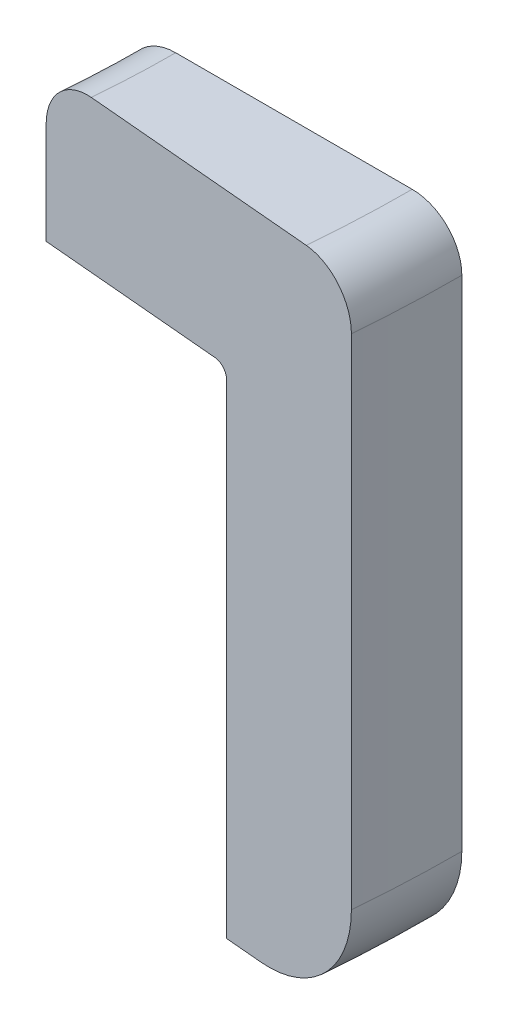
ISO-10303-21;
HEADER;
FILE_DESCRIPTION(('STEP AP214'),'2;1');
FILE_NAME('part.step','',(''),(''),'','','');
FILE_SCHEMA(('AUTOMOTIVE_DESIGN { 1 0 10303 214 1 1 1 1 }'));
ENDSEC;
DATA;
#1=APPLICATION_CONTEXT('core data for automotive mechanical design processes');
#2=APPLICATION_PROTOCOL_DEFINITION('international standard','automotive_design',2000,#1);
#3=PRODUCT_CONTEXT('',#1,'mechanical');
#4=PRODUCT('Part','Part','',(#3));
#5=PRODUCT_RELATED_PRODUCT_CATEGORY('part','',(#4));
#6=PRODUCT_DEFINITION_FORMATION('','',#4);
#7=PRODUCT_DEFINITION_CONTEXT('part definition',#1,'design');
#8=PRODUCT_DEFINITION('design','',#6,#7);
#9=PRODUCT_DEFINITION_SHAPE('','',#8);
#10=(LENGTH_UNIT() NAMED_UNIT(*) SI_UNIT(.MILLI.,.METRE.));
#11=(NAMED_UNIT(*) PLANE_ANGLE_UNIT() SI_UNIT($,.RADIAN.));
#12=(NAMED_UNIT(*) SI_UNIT($,.STERADIAN.) SOLID_ANGLE_UNIT());
#13=UNCERTAINTY_MEASURE_WITH_UNIT(LENGTH_MEASURE(1.E-05),#10,'distance_accuracy_value','');
#14=(GEOMETRIC_REPRESENTATION_CONTEXT(3) GLOBAL_UNCERTAINTY_ASSIGNED_CONTEXT((#13)) GLOBAL_UNIT_ASSIGNED_CONTEXT((#10,
#11,#12)) REPRESENTATION_CONTEXT('',''));
#15=CARTESIAN_POINT('',(0.,0.,0.));
#16=DIRECTION('',(0.,0.,1.));
#17=DIRECTION('',(1.,0.,0.));
#18=AXIS2_PLACEMENT_3D('',#15,#16,#17);
#19=CARTESIAN_POINT('',(-0.165150102818243,-6.,3.78255923524837));
#20=DIRECTION('',(0.,1.,0.));
#21=DIRECTION('',(-1.,0.,0.));
#22=AXIS2_PLACEMENT_3D('',#19,#20,#21);
#23=PLANE('',#22);
#24=CARTESIAN_POINT('',(-43.4,-6.00000000000001,0.));
#25=DIRECTION('',(0.,1.,0.));
#26=DIRECTION('',(-1.,0.,0.));
#27=AXIS2_PLACEMENT_3D('',#24,#25,#26);
#28=CIRCLE('',#27,44.9330690308202);
#29=CARTESIAN_POINT('',(1.3620851374935,-6.,3.91617500531294));
#30=VERTEX_POINT('',#29);
#31=CARTESIAN_POINT('',(1.5330690308202,-6.,0.));
#32=VERTEX_POINT('',#31);
#33=EDGE_CURVE('E42',#30,#32,#28,.T.);
#34=ORIENTED_EDGE('',*,*,#33,.F.);
#35=DIRECTION('',(0.996194698091746,0.,0.0871557427476584));
#36=VECTOR('',#35,1.);
#37=CARTESIAN_POINT('',(-0.165150102818243,-6.,3.78255923524837));
#38=LINE('',#37,#36);
#39=CARTESIAN_POINT('',(-0.165150102818243,-6.,3.78255923524837));
#40=VERTEX_POINT('',#39);
#41=EDGE_CURVE('E125',#40,#30,#38,.T.);
#42=ORIENTED_EDGE('',*,*,#41,.F.);
#43=CARTESIAN_POINT('',(-43.4,-6.00000000000001,0.));
#44=DIRECTION('',(0.,1.,0.));
#45=DIRECTION('',(-1.,0.,0.));
#46=AXIS2_PLACEMENT_3D('',#43,#44,#45);
#47=CIRCLE('',#46,43.4);
#48=CARTESIAN_POINT('',(0.,-6.,0.));
#49=VERTEX_POINT('',#48);
#50=EDGE_CURVE('E11',#40,#49,#47,.T.);
#51=ORIENTED_EDGE('',*,*,#50,.T.);
#52=DIRECTION('',(1.,0.,0.));
#53=VECTOR('',#52,1.);
#54=CARTESIAN_POINT('',(0.,-6.,0.));
#55=LINE('',#54,#53);
#56=EDGE_CURVE('E122',#49,#32,#55,.T.);
#57=ORIENTED_EDGE('',*,*,#56,.T.);
#58=EDGE_LOOP('',(#34,#42,#51,#57));
#59=FACE_BOUND('',#58,.T.);
#60=ADVANCED_FACE('F35',(#59),#23,.F.);
#61=CARTESIAN_POINT('',(-43.4,-2.00000000000001,0.));
#62=DIRECTION('',(0.,1.,0.));
#63=DIRECTION('',(-1.,0.,0.));
#64=AXIS2_PLACEMENT_3D('',#61,#62,#63);
#65=TOROIDAL_SURFACE('',#64,44.9330690308202,4.);
#66=CARTESIAN_POINT('',(-43.4,-1.99999999999998,0.));
#67=DIRECTION('',(0.,1.,0.));
#68=DIRECTION('',(-1.,0.,0.));
#69=AXIS2_PLACEMENT_3D('',#66,#67,#68);
#70=CIRCLE('',#69,48.9330690308202);
#71=CARTESIAN_POINT('',(5.3468639298605,-1.99999999999997,4.26479797630358));
#72=VERTEX_POINT('',#71);
#73=CARTESIAN_POINT('',(5.53306903082023,-1.99999999999997,0.));
#74=VERTEX_POINT('',#73);
#75=EDGE_CURVE('E187',#72,#74,#70,.T.);
#76=ORIENTED_EDGE('',*,*,#75,.F.);
#77=CARTESIAN_POINT('',(1.36208513749352,-2.,3.91617500531294));
#78=DIRECTION('',(-0.0871557427476584,0.,0.996194698091746));
#79=DIRECTION('',(0.996194698091746,0.,0.0871557427476584));
#80=AXIS2_PLACEMENT_3D('',#77,#78,#79);
#81=CIRCLE('',#80,4.);
#82=EDGE_CURVE('E152',#30,#72,#81,.T.);
#83=ORIENTED_EDGE('',*,*,#82,.F.);
#84=ORIENTED_EDGE('',*,*,#33,.T.);
#85=CARTESIAN_POINT('',(1.53306903082023,-2.,0.));
#86=DIRECTION('',(0.,0.,1.));
#87=DIRECTION('',(1.,0.,0.));
#88=AXIS2_PLACEMENT_3D('',#85,#86,#87);
#89=CIRCLE('',#88,4.);
#90=EDGE_CURVE('E129',#32,#74,#89,.T.);
#91=ORIENTED_EDGE('',*,*,#90,.T.);
#92=EDGE_LOOP('',(#76,#83,#84,#91));
#93=FACE_BOUND('',#92,.T.);
#94=ADVANCED_FACE('F190',(#93),#65,.T.);
#95=CARTESIAN_POINT('',(-43.4,20.1095839330054,0.));
#96=DIRECTION('',(0.,1.,0.));
#97=DIRECTION('',(-1.,0.,0.));
#98=AXIS2_PLACEMENT_3D('',#95,#96,#97);
#99=CYLINDRICAL_SURFACE('',#98,48.9330690308202);
#100=CARTESIAN_POINT('',(-43.4,18.1095839330053,0.));
#101=DIRECTION('',(0.,1.,0.));
#102=DIRECTION('',(-1.,0.,0.));
#103=AXIS2_PLACEMENT_3D('',#100,#101,#102);
#104=CIRCLE('',#103,48.9330690308202);
#105=CARTESIAN_POINT('',(5.3468639298605,18.1095839330053,4.26479797630358));
#106=VERTEX_POINT('',#105);
#107=CARTESIAN_POINT('',(5.53306903082023,18.1095839330053,0.));
#108=VERTEX_POINT('',#107);
#109=EDGE_CURVE('E184',#106,#108,#104,.T.);
#110=ORIENTED_EDGE('',*,*,#109,.F.);
#111=DIRECTION('',(0.,1.,0.));
#112=VECTOR('',#111,1.);
#113=CARTESIAN_POINT('',(5.3468639298605,0.,4.26479797630358));
#114=LINE('',#113,#112);
#115=EDGE_CURVE('E155',#72,#106,#114,.T.);
#116=ORIENTED_EDGE('',*,*,#115,.F.);
#117=ORIENTED_EDGE('',*,*,#75,.T.);
#118=DIRECTION('',(0.,1.,0.));
#119=VECTOR('',#118,1.);
#120=CARTESIAN_POINT('',(5.53306903082023,0.,0.));
#121=LINE('',#120,#119);
#122=EDGE_CURVE('E131',#74,#108,#121,.T.);
#123=ORIENTED_EDGE('',*,*,#122,.T.);
#124=EDGE_LOOP('',(#110,#116,#117,#123));
#125=FACE_BOUND('',#124,.T.);
#126=ADVANCED_FACE('F217',(#125),#99,.T.);
#127=CARTESIAN_POINT('',(-43.4,18.1095839330054,0.));
#128=DIRECTION('',(0.,1.,0.));
#129=DIRECTION('',(-1.,0.,0.));
#130=AXIS2_PLACEMENT_3D('',#127,#128,#129);
#131=TOROIDAL_SURFACE('',#130,46.9330690308202,2.);
#132=CARTESIAN_POINT('',(-43.4,20.1095839330053,0.));
#133=DIRECTION('',(0.,1.,0.));
#134=DIRECTION('',(-1.,0.,0.));
#135=AXIS2_PLACEMENT_3D('',#132,#133,#134);
#136=CIRCLE('',#135,46.9330690308202);
#137=CARTESIAN_POINT('',(3.354474533677,20.1095839330054,4.09048649080826));
#138=VERTEX_POINT('',#137);
#139=CARTESIAN_POINT('',(3.53306903082022,20.1095839330054,0.));
#140=VERTEX_POINT('',#139);
#141=EDGE_CURVE('E182',#138,#140,#136,.T.);
#142=ORIENTED_EDGE('',*,*,#141,.F.);
#143=CARTESIAN_POINT('',(3.35447453367701,18.1095839330054,4.09048649080826));
#144=DIRECTION('',(-0.0871557427476584,0.,0.996194698091746));
#145=DIRECTION('',(0.996194698091746,0.,0.0871557427476584));
#146=AXIS2_PLACEMENT_3D('',#143,#144,#145);
#147=CIRCLE('',#146,2.);
#148=EDGE_CURVE('E157',#106,#138,#147,.T.);
#149=ORIENTED_EDGE('',*,*,#148,.F.);
#150=ORIENTED_EDGE('',*,*,#109,.T.);
#151=CARTESIAN_POINT('',(3.53306903082023,18.1095839330054,0.));
#152=DIRECTION('',(0.,0.,1.));
#153=DIRECTION('',(1.,0.,0.));
#154=AXIS2_PLACEMENT_3D('',#151,#152,#153);
#155=CIRCLE('',#154,2.);
#156=EDGE_CURVE('E135',#108,#140,#155,.T.);
#157=ORIENTED_EDGE('',*,*,#156,.T.);
#158=EDGE_LOOP('',(#142,#149,#150,#157));
#159=FACE_BOUND('',#158,.T.);
#160=ADVANCED_FACE('F214',(#159),#131,.T.);
#161=CARTESIAN_POINT('',(3.354474533677,20.1095839330054,4.09048649080826));
#162=DIRECTION('',(0.,-1.,0.));
#163=DIRECTION('',(1.,0.,0.));
#164=AXIS2_PLACEMENT_3D('',#161,#162,#163);
#165=PLANE('',#164);
#166=CARTESIAN_POINT('',(-43.4,20.1095839330054,0.));
#167=DIRECTION('',(0.,1.,0.));
#168=DIRECTION('',(-1.,0.,0.));
#169=AXIS2_PLACEMENT_3D('',#166,#167,#168);
#170=CIRCLE('',#169,37.4);
#171=CARTESIAN_POINT('',(-6.1423182913687,20.1095839330054,3.25962477876242));
#172=VERTEX_POINT('',#171);
#173=CARTESIAN_POINT('',(-5.99999999999999,20.1095839330054,0.));
#174=VERTEX_POINT('',#173);
#175=EDGE_CURVE('E180',#172,#174,#170,.T.);
#176=ORIENTED_EDGE('',*,*,#175,.F.);
#177=DIRECTION('',(-0.996194698091746,0.,-0.0871557427476584));
#178=VECTOR('',#177,1.);
#179=CARTESIAN_POINT('',(3.354474533677,20.1095839330054,4.09048649080826));
#180=LINE('',#179,#178);
#181=EDGE_CURVE('E160',#138,#172,#180,.T.);
#182=ORIENTED_EDGE('',*,*,#181,.F.);
#183=ORIENTED_EDGE('',*,*,#141,.T.);
#184=DIRECTION('',(-1.,0.,0.));
#185=VECTOR('',#184,1.);
#186=CARTESIAN_POINT('',(3.53306903082022,20.1095839330054,0.));
#187=LINE('',#186,#185);
#188=EDGE_CURVE('E138',#140,#174,#187,.T.);
#189=ORIENTED_EDGE('',*,*,#188,.T.);
#190=EDGE_LOOP('',(#176,#182,#183,#189));
#191=FACE_BOUND('',#190,.T.);
#192=ADVANCED_FACE('F210',(#191),#165,.F.);
#193=CARTESIAN_POINT('',(-43.4,18.1095839330054,0.));
#194=DIRECTION('',(0.,1.,0.));
#195=DIRECTION('',(-1.,0.,0.));
#196=AXIS2_PLACEMENT_3D('',#193,#194,#195);
#197=TOROIDAL_SURFACE('',#196,37.4,2.);
#198=CARTESIAN_POINT('',(-43.4,18.1095839330053,0.));
#199=DIRECTION('',(0.,1.,0.));
#200=DIRECTION('',(-1.,0.,0.));
#201=AXIS2_PLACEMENT_3D('',#198,#199,#200);
#202=CIRCLE('',#201,35.4);
#203=CARTESIAN_POINT('',(-8.13470768755221,18.1095839330053,3.08531329326711));
#204=VERTEX_POINT('',#203);
#205=CARTESIAN_POINT('',(-8.,18.1095839330053,0.));
#206=VERTEX_POINT('',#205);
#207=EDGE_CURVE('E178',#204,#206,#202,.T.);
#208=ORIENTED_EDGE('',*,*,#207,.F.);
#209=CARTESIAN_POINT('',(-6.14231829136872,18.1095839330054,3.25962477876242));
#210=DIRECTION('',(-0.0871557427476584,0.,0.996194698091746));
#211=DIRECTION('',(0.996194698091746,0.,0.0871557427476584));
#212=AXIS2_PLACEMENT_3D('',#209,#210,#211);
#213=CIRCLE('',#212,2.);
#214=EDGE_CURVE('E163',#172,#204,#213,.T.);
#215=ORIENTED_EDGE('',*,*,#214,.F.);
#216=ORIENTED_EDGE('',*,*,#175,.T.);
#217=CARTESIAN_POINT('',(-6.,18.1095839330054,0.));
#218=DIRECTION('',(0.,0.,1.));
#219=DIRECTION('',(1.,0.,0.));
#220=AXIS2_PLACEMENT_3D('',#217,#218,#219);
#221=CIRCLE('',#220,2.);
#222=EDGE_CURVE('E141',#174,#206,#221,.T.);
#223=ORIENTED_EDGE('',*,*,#222,.T.);
#224=EDGE_LOOP('',(#208,#215,#216,#223));
#225=FACE_BOUND('',#224,.T.);
#226=ADVANCED_FACE('F206',(#225),#197,.T.);
#227=CARTESIAN_POINT('',(-43.4,20.1095839330054,0.));
#228=DIRECTION('',(0.,1.,0.));
#229=DIRECTION('',(-1.,0.,0.));
#230=AXIS2_PLACEMENT_3D('',#227,#228,#229);
#231=CYLINDRICAL_SURFACE('',#230,35.4);
#232=CARTESIAN_POINT('',(-43.4,14.,0.));
#233=DIRECTION('',(0.,1.,0.));
#234=DIRECTION('',(-1.,0.,0.));
#235=AXIS2_PLACEMENT_3D('',#232,#233,#234);
#236=CIRCLE('',#235,35.4);
#237=CARTESIAN_POINT('',(-8.13470768755221,14.,3.08531329326711));
#238=VERTEX_POINT('',#237);
#239=CARTESIAN_POINT('',(-8.,14.,0.));
#240=VERTEX_POINT('',#239);
#241=EDGE_CURVE('E176',#238,#240,#236,.T.);
#242=ORIENTED_EDGE('',*,*,#241,.F.);
#243=DIRECTION('',(0.,-1.,0.));
#244=VECTOR('',#243,1.);
#245=CARTESIAN_POINT('',(-8.13470768755221,14.,3.08531329326711));
#246=LINE('',#245,#244);
#247=EDGE_CURVE('E166',#204,#238,#246,.T.);
#248=ORIENTED_EDGE('',*,*,#247,.F.);
#249=ORIENTED_EDGE('',*,*,#207,.T.);
#250=DIRECTION('',(0.,-1.,0.));
#251=VECTOR('',#250,1.);
#252=CARTESIAN_POINT('',(-8.,14.,0.));
#253=LINE('',#252,#251);
#254=EDGE_CURVE('E144',#206,#240,#253,.T.);
#255=ORIENTED_EDGE('',*,*,#254,.T.);
#256=EDGE_LOOP('',(#242,#248,#249,#255));
#257=FACE_BOUND('',#256,.T.);
#258=ADVANCED_FACE('F203',(#257),#231,.F.);
#259=CARTESIAN_POINT('',(-0.66324745186412,14.,3.73898136387454));
#260=DIRECTION('',(0.,1.,0.));
#261=DIRECTION('',(-1.,0.,0.));
#262=AXIS2_PLACEMENT_3D('',#259,#260,#261);
#263=PLANE('',#262);
#264=CARTESIAN_POINT('',(-43.4,14.,0.));
#265=DIRECTION('',(0.,1.,0.));
#266=DIRECTION('',(-1.,0.,0.));
#267=AXIS2_PLACEMENT_3D('',#264,#265,#266);
#268=CIRCLE('',#267,42.9);
#269=CARTESIAN_POINT('',(-0.663247451864119,14.,3.73898136387454));
#270=VERTEX_POINT('',#269);
#271=CARTESIAN_POINT('',(-0.500000000000003,14.,0.));
#272=VERTEX_POINT('',#271);
#273=EDGE_CURVE('E57',#270,#272,#268,.T.);
#274=ORIENTED_EDGE('',*,*,#273,.F.);
#275=DIRECTION('',(0.996194698091746,0.,0.0871557427476584));
#276=VECTOR('',#275,1.);
#277=CARTESIAN_POINT('',(-0.66324745186412,14.,3.73898136387454));
#278=LINE('',#277,#276);
#279=EDGE_CURVE('E169',#238,#270,#278,.T.);
#280=ORIENTED_EDGE('',*,*,#279,.F.);
#281=ORIENTED_EDGE('',*,*,#241,.T.);
#282=DIRECTION('',(1.,0.,0.));
#283=VECTOR('',#282,1.);
#284=CARTESIAN_POINT('',(-0.500000000000004,14.,0.));
#285=LINE('',#284,#283);
#286=EDGE_CURVE('E147',#240,#272,#285,.T.);
#287=ORIENTED_EDGE('',*,*,#286,.T.);
#288=EDGE_LOOP('',(#274,#280,#281,#287));
#289=FACE_BOUND('',#288,.T.);
#290=ADVANCED_FACE('F200',(#289),#263,.F.);
#291=CARTESIAN_POINT('',(-43.4,13.5,0.));
#292=DIRECTION('',(0.,1.,0.));
#293=DIRECTION('',(-1.,0.,0.));
#294=AXIS2_PLACEMENT_3D('',#291,#292,#293);
#295=TOROIDAL_SURFACE('',#294,42.9,0.5);
#296=CARTESIAN_POINT('',(-43.4,13.5,0.));
#297=DIRECTION('',(0.,1.,0.));
#298=DIRECTION('',(-1.,0.,0.));
#299=AXIS2_PLACEMENT_3D('',#296,#297,#298);
#300=CIRCLE('',#299,43.4);
#301=CARTESIAN_POINT('',(-0.165150102818243,13.5,3.78255923524837));
#302=VERTEX_POINT('',#301);
#303=CARTESIAN_POINT('',(0.,13.5,0.));
#304=VERTEX_POINT('',#303);
#305=EDGE_CURVE('E112',#302,#304,#300,.T.);
#306=ORIENTED_EDGE('',*,*,#305,.F.);
#307=CARTESIAN_POINT('',(-0.663247451864116,13.5,3.73898136387454));
#308=DIRECTION('',(0.0871557427476584,0.,-0.996194698091746));
#309=DIRECTION('',(0.996194698091746,0.,0.0871557427476584));
#310=AXIS2_PLACEMENT_3D('',#307,#308,#309);
#311=CIRCLE('',#310,0.5);
#312=EDGE_CURVE('E171',#270,#302,#311,.T.);
#313=ORIENTED_EDGE('',*,*,#312,.F.);
#314=ORIENTED_EDGE('',*,*,#273,.T.);
#315=CARTESIAN_POINT('',(-0.5,13.5,0.));
#316=DIRECTION('',(0.,0.,-1.));
#317=DIRECTION('',(1.,0.,0.));
#318=AXIS2_PLACEMENT_3D('',#315,#316,#317);
#319=CIRCLE('',#318,0.5);
#320=EDGE_CURVE('E117',#272,#304,#319,.T.);
#321=ORIENTED_EDGE('',*,*,#320,.T.);
#322=EDGE_LOOP('',(#306,#313,#314,#321));
#323=FACE_BOUND('',#322,.T.);
#324=ADVANCED_FACE('F196',(#323),#295,.F.);
#325=CARTESIAN_POINT('',(-43.4,20.1095839330054,0.));
#326=DIRECTION('',(0.,1.,0.));
#327=DIRECTION('',(-1.,0.,0.));
#328=AXIS2_PLACEMENT_3D('',#325,#326,#327);
#329=CYLINDRICAL_SURFACE('',#328,43.4);
#330=DIRECTION('',(0.,-1.,0.));
#331=VECTOR('',#330,1.);
#332=CARTESIAN_POINT('',(-0.165150102818243,0.,3.78255923524837));
#333=LINE('',#332,#331);
#334=EDGE_CURVE('E49',#302,#40,#333,.T.);
#335=ORIENTED_EDGE('',*,*,#334,.F.);
#336=ORIENTED_EDGE('',*,*,#305,.T.);
#337=DIRECTION('',(0.,-1.,0.));
#338=VECTOR('',#337,1.);
#339=CARTESIAN_POINT('',(0.,0.,0.));
#340=LINE('',#339,#338);
#341=EDGE_CURVE('E110',#304,#49,#340,.T.);
#342=ORIENTED_EDGE('',*,*,#341,.T.);
#343=ORIENTED_EDGE('',*,*,#50,.F.);
#344=EDGE_LOOP('',(#335,#336,#342,#343));
#345=FACE_BOUND('',#344,.T.);
#346=ADVANCED_FACE('F111',(#345),#329,.F.);
#347=CARTESIAN_POINT('',(1.36208513749352,-2.,3.91617500531294));
#348=DIRECTION('',(-0.0871557427476584,0.,0.996194698091746));
#349=DIRECTION('',(0.996194698091746,0.,0.0871557427476584));
#350=AXIS2_PLACEMENT_3D('',#347,#348,#349);
#351=PLANE('',#350);
#352=ORIENTED_EDGE('',*,*,#334,.T.);
#353=ORIENTED_EDGE('',*,*,#41,.T.);
#354=ORIENTED_EDGE('',*,*,#82,.T.);
#355=ORIENTED_EDGE('',*,*,#115,.T.);
#356=ORIENTED_EDGE('',*,*,#148,.T.);
#357=ORIENTED_EDGE('',*,*,#181,.T.);
#358=ORIENTED_EDGE('',*,*,#214,.T.);
#359=ORIENTED_EDGE('',*,*,#247,.T.);
#360=ORIENTED_EDGE('',*,*,#279,.T.);
#361=ORIENTED_EDGE('',*,*,#312,.T.);
#362=EDGE_LOOP('',(#352,#353,#354,#355,#356,#357,#358,#359,#360,#361));
#363=FACE_BOUND('',#362,.T.);
#364=ADVANCED_FACE('F192',(#363),#351,.T.);
#365=CARTESIAN_POINT('',(1.53306903082023,-2.,0.));
#366=DIRECTION('',(0.,0.,1.));
#367=DIRECTION('',(1.,0.,0.));
#368=AXIS2_PLACEMENT_3D('',#365,#366,#367);
#369=PLANE('',#368);
#370=ORIENTED_EDGE('',*,*,#56,.F.);
#371=ORIENTED_EDGE('',*,*,#341,.F.);
#372=ORIENTED_EDGE('',*,*,#320,.F.);
#373=ORIENTED_EDGE('',*,*,#286,.F.);
#374=ORIENTED_EDGE('',*,*,#254,.F.);
#375=ORIENTED_EDGE('',*,*,#222,.F.);
#376=ORIENTED_EDGE('',*,*,#188,.F.);
#377=ORIENTED_EDGE('',*,*,#156,.F.);
#378=ORIENTED_EDGE('',*,*,#122,.F.);
#379=ORIENTED_EDGE('',*,*,#90,.F.);
#380=EDGE_LOOP('',(#370,#371,#372,#373,#374,#375,#376,#377,#378,#379));
#381=FACE_BOUND('',#380,.T.);
#382=ADVANCED_FACE('F126',(#381),#369,.F.);
#383=CLOSED_SHELL('',(#60,#94,#126,#160,#192,#226,#258,#290,#324,#346,#364,#382));
#384=MANIFOLD_SOLID_BREP('B2',#383);
#385=ADVANCED_BREP_SHAPE_REPRESENTATION('',(#18,#384),#14);
#386=SHAPE_DEFINITION_REPRESENTATION(#9,#385);
ENDSEC;
END-ISO-10303-21;
